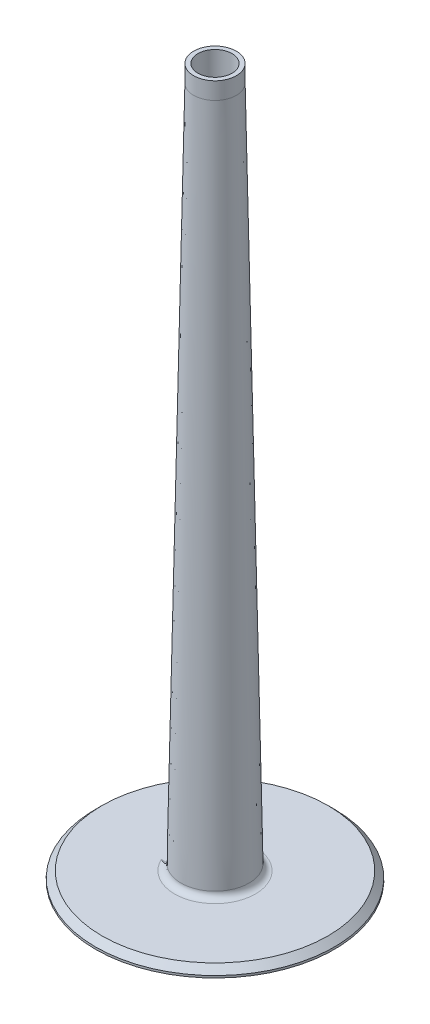
ISO-10303-21;
HEADER;
FILE_DESCRIPTION(('STEP AP214'),'2;1');
FILE_NAME('part.step','',(''),(''),'','','');
FILE_SCHEMA(('AUTOMOTIVE_DESIGN { 1 0 10303 214 1 1 1 1 }'));
ENDSEC;
DATA;
#1=APPLICATION_CONTEXT('core data for automotive mechanical design processes');
#2=APPLICATION_PROTOCOL_DEFINITION('international standard','automotive_design',2000,#1);
#3=PRODUCT_CONTEXT('',#1,'mechanical');
#4=PRODUCT('Part','Part','',(#3));
#5=PRODUCT_RELATED_PRODUCT_CATEGORY('part','',(#4));
#6=PRODUCT_DEFINITION_FORMATION('','',#4);
#7=PRODUCT_DEFINITION_CONTEXT('part definition',#1,'design');
#8=PRODUCT_DEFINITION('design','',#6,#7);
#9=PRODUCT_DEFINITION_SHAPE('','',#8);
#10=(LENGTH_UNIT() NAMED_UNIT(*) SI_UNIT(.MILLI.,.METRE.));
#11=(NAMED_UNIT(*) PLANE_ANGLE_UNIT() SI_UNIT($,.RADIAN.));
#12=(NAMED_UNIT(*) SI_UNIT($,.STERADIAN.) SOLID_ANGLE_UNIT());
#13=UNCERTAINTY_MEASURE_WITH_UNIT(LENGTH_MEASURE(1.E-05),#10,'distance_accuracy_value','');
#14=(GEOMETRIC_REPRESENTATION_CONTEXT(3) GLOBAL_UNCERTAINTY_ASSIGNED_CONTEXT((#13)) GLOBAL_UNIT_ASSIGNED_CONTEXT((#10,
#11,#12)) REPRESENTATION_CONTEXT('',''));
#15=CARTESIAN_POINT('',(0.,0.,0.));
#16=DIRECTION('',(0.,0.,1.));
#17=DIRECTION('',(1.,0.,0.));
#18=AXIS2_PLACEMENT_3D('',#15,#16,#17);
#19=CARTESIAN_POINT('',(0.,254.,0.));
#20=DIRECTION('',(0.,-1.,0.));
#21=DIRECTION('',(0.,0.,-1.));
#22=AXIS2_PLACEMENT_3D('',#19,#20,#21);
#23=CONICAL_SURFACE('',#22,7.9375,0.0187478031977445);
#24=CARTESIAN_POINT('',(-10.9986380954076,1.31233542988829E-08,6.3498));
#25=CARTESIAN_POINT('',(-10.9661542839363,1.8233393195671E-06,6.40607206991448));
#26=CARTESIAN_POINT('',(-10.9332096805369,0.00310269069035877,6.46201479725815));
#27=CARTESIAN_POINT('',(-10.8666748452448,0.0153468969863142,6.57284084258527));
#28=CARTESIAN_POINT('',(-10.8330846672008,0.0244897340620682,6.62772424817039));
#29=CARTESIAN_POINT('',(-10.7315971060793,0.0608037732642193,6.79044586185834));
#30=CARTESIAN_POINT('',(-10.6631335523318,0.0968591372913604,6.89609482020866));
#31=CARTESIAN_POINT('',(-10.5349289767664,0.18643584984036,7.08719809153657));
#32=CARTESIAN_POINT('',(-10.4750266462951,0.237726882466519,7.17360815162488));
#33=CARTESIAN_POINT('',(-10.3590417410145,0.357744114164864,7.33620002025002));
#34=CARTESIAN_POINT('',(-10.3029517020728,0.426434921148173,7.41240211697634));
#35=CARTESIAN_POINT('',(-10.2108354934768,0.56165114992968,7.53430871109204));
#36=CARTESIAN_POINT('',(-10.1732715971275,0.624537115578603,7.58290078618485));
#37=CARTESIAN_POINT('',(-10.1040072047982,0.759408570463965,7.67076859195739));
#38=CARTESIAN_POINT('',(-10.0722990805292,0.831382012606909,7.71005646230527));
#39=CARTESIAN_POINT('',(-10.0214488766076,0.970778224625026,7.77173685513282));
#40=CARTESIAN_POINT('',(-10.0010970258484,1.03699576980835,7.79584680184522));
#41=CARTESIAN_POINT('',(-9.9672621720457,1.17376969697781,7.83491118012799));
#42=CARTESIAN_POINT('',(-9.95377504044796,1.24432344241636,7.84987111575895));
#43=CARTESIAN_POINT('',(-9.93467318175553,1.38826201691278,7.86968760096606));
#44=CARTESIAN_POINT('',(-9.92909643153456,1.46165877691785,7.87449546508906));
#45=CARTESIAN_POINT('',(-9.92643180501236,1.60852621724321,7.87342379686221));
#46=CARTESIAN_POINT('',(-9.92934232422056,1.68199688096726,7.86754628462698));
#47=CARTESIAN_POINT('',(-9.94278697207492,1.82073908235096,7.84634684897258));
#48=CARTESIAN_POINT('',(-9.95269367573652,1.88619681619626,7.83181669384942));
#49=CARTESIAN_POINT('',(-9.97870464754827,2.01350027268655,7.79477109231769));
#50=CARTESIAN_POINT('',(-9.99481027634715,2.07534519889417,7.77225389285781));
#51=CARTESIAN_POINT('',(-10.0334166723422,2.19802223213817,7.71858747265611));
#52=CARTESIAN_POINT('',(-10.0562550585433,2.258547785773,7.68698559928534));
#53=CARTESIAN_POINT('',(-10.1065985965942,2.37345558209999,7.61709530115483));
#54=CARTESIAN_POINT('',(-10.1341058125403,2.42783508982519,7.5788039187332));
#55=CARTESIAN_POINT('',(-10.1978518813264,2.53909379207719,7.48934946494921));
#56=CARTESIAN_POINT('',(-10.234774460332,2.59471177563511,7.4371077353616));
#57=CARTESIAN_POINT('',(-10.3119965815803,2.69658731919294,7.32636341385606));
#58=CARTESIAN_POINT('',(-10.3522989149144,2.7428370328143,7.26785563599769));
#59=CARTESIAN_POINT('',(-10.4432901858431,2.83409361587009,7.13362319280051));
#60=CARTESIAN_POINT('',(-10.4944470406609,2.87701120879726,7.05679256274164));
#61=CARTESIAN_POINT('',(-10.5980846313508,2.94885649438555,6.89770137179443));
#62=CARTESIAN_POINT('',(-10.6505653896735,2.97778394963592,6.81544071878627));
#63=CARTESIAN_POINT('',(-10.7416690144113,3.01556466826313,6.66925237103833));
#64=CARTESIAN_POINT('',(-10.7803196545716,3.02769185550869,6.60616905803933));
#65=CARTESIAN_POINT('',(-10.8570140767606,3.04390338510256,6.47876710666235));
#66=CARTESIAN_POINT('',(-10.8950587864383,3.04800149483496,6.41445077414674));
#67=CARTESIAN_POINT('',(-10.9325978654994,3.04799998687663,6.3498));
#68=B_SPLINE_CURVE_WITH_KNOTS('',3,(#24,#25,#26,#27,#28,#29,#30,#31,#32,#33,#34,#35,#36,#37,#38,
#39,#40,#41,#42,#43,#44,#45,#46,#47,#48,#49,#50,#51,#52,#53,#54,#55,#56,#57,#58,#59,#60,#61,#62,
#63,#64,#65,#66,#67),.UNSPECIFIED.,.F.,.F.,(4,2,2,2,2,2,2,2,2,2,2,2,2,2,2,2,2,2,2,2,2,4),(0.,
0.19474624218606,0.389476310035777,0.779825918996431,1.12920632620116,1.47788170257181,
1.7406150269171,2.00300363747913,2.22214450305096,2.44115341753552,2.66121025173346,
2.8812254876024,3.08366918195934,3.28615733757051,3.50133963675868,3.71661731733759,
3.96999914654659,4.22359232568203,4.52778479726055,4.83198243076321,5.05646903045754,
5.28057036702371),.UNSPECIFIED.);
#69=CARTESIAN_POINT('',(-10.0900593872929,2.33538284217058,7.64005189175908));
#70=VERTEX_POINT('',#69);
#71=CARTESIAN_POINT('',(-10.9324817000762,3.048,6.35));
#72=VERTEX_POINT('',#71);
#73=EDGE_CURVE('E168',#70,#72,#68,.T.);
#74=ORIENTED_EDGE('',*,*,#73,.F.);
#75=CARTESIAN_POINT('',(0.,2.3353828421705,0.));
#76=DIRECTION('',(0.,1.,0.));
#77=DIRECTION('',(0.,0.,1.));
#78=AXIS2_PLACEMENT_3D('',#75,#76,#77);
#79=CIRCLE('',#78,12.6562115717093);
#80=CARTESIAN_POINT('',(-10.0900593872929,2.33538284217058,-7.64005189175908));
#81=VERTEX_POINT('',#80);
#82=EDGE_CURVE('E130',#70,#81,#79,.T.);
#83=ORIENTED_EDGE('',*,*,#82,.T.);
#84=CARTESIAN_POINT('',(-10.9325978654994,3.04799998687663,-6.3498));
#85=CARTESIAN_POINT('',(-10.8999979201371,3.04799780508361,-6.40593417678844));
#86=CARTESIAN_POINT('',(-10.8670360327973,3.0449123042439,-6.46179741861725));
#87=CARTESIAN_POINT('',(-10.8006542589209,3.03268977439008,-6.57259045315219));
#88=CARTESIAN_POINT('',(-10.7672343292529,3.02355217159326,-6.62752015684571));
#89=CARTESIAN_POINT('',(-10.6664357739375,2.98714087516176,-6.79072654074615));
#90=CARTESIAN_POINT('',(-10.5987755139002,2.9508703229383,-6.89697871548276));
#91=CARTESIAN_POINT('',(-10.4730979308032,2.86050085720492,-7.08918749483312));
#92=CARTESIAN_POINT('',(-10.4148273382496,2.80874517999183,-7.17609723820158));
#93=CARTESIAN_POINT('',(-10.302974296996,2.68735527570252,-7.33969690959744));
#94=CARTESIAN_POINT('',(-10.2493793656318,2.61777073472156,-7.41641435387412));
#95=CARTESIAN_POINT('',(-10.163955896329,2.48275537043931,-7.53708559341101));
#96=CARTESIAN_POINT('',(-10.1301872620934,2.42141146199877,-7.58425674264817));
#97=CARTESIAN_POINT('',(-10.0687004304121,2.29011021657658,-7.66975963828376));
#98=CARTESIAN_POINT('',(-10.0409748370741,2.22016357417996,-7.70810219300916));
#99=CARTESIAN_POINT('',(-9.99707248344839,2.08387342075445,-7.76909426221353));
#100=CARTESIAN_POINT('',(-9.97978845911007,2.01855662772188,-7.79323342323721));
#101=CARTESIAN_POINT('',(-9.9521679066627,1.88386625109741,-7.83255972654309));
#102=CARTESIAN_POINT('',(-9.94182740994984,1.8144950095339,-7.84775198185698));
#103=CARTESIAN_POINT('',(-9.92891257130494,1.67332364409966,-7.86834874614469));
#104=CARTESIAN_POINT('',(-9.92636660053408,1.60151560674109,-7.87371747016924));
#105=CARTESIAN_POINT('',(-9.92936949412806,1.45803311143739,-7.8742606509996));
#106=CARTESIAN_POINT('',(-9.93491826728178,1.38635865199622,-7.86943522267224));
#107=CARTESIAN_POINT('',(-9.95308210272741,1.24959843405244,-7.85058820690649));
#108=CARTESIAN_POINT('',(-9.96525892412575,1.18437393339872,-7.83712853802717));
#109=CARTESIAN_POINT('',(-9.99553457201065,1.05751939922595,-7.80234353069956));
#110=CARTESIAN_POINT('',(-10.0136349211939,0.995890294740902,-7.78101616960982));
#111=CARTESIAN_POINT('',(-10.056511386377,0.87217877915044,-7.72933923751777));
#112=CARTESIAN_POINT('',(-10.0817259859012,0.810508200796656,-7.69837414057168));
#113=CARTESIAN_POINT('',(-10.1366611808046,0.693363388835278,-7.62954736864455));
#114=CARTESIAN_POINT('',(-10.1663839489561,0.637892165602109,-7.59168236637951));
#115=CARTESIAN_POINT('',(-10.2351130907099,0.523695473751836,-7.5024579274402));
#116=CARTESIAN_POINT('',(-10.2748135193867,0.466325644177062,-7.44990013269533));
#117=CARTESIAN_POINT('',(-10.3573805605564,0.361177351411474,-7.33808862851842));
#118=CARTESIAN_POINT('',(-10.4002499596277,0.313407470359724,-7.27882900109429));
#119=CARTESIAN_POINT('',(-10.4965870141623,0.219142261434897,-7.14251880446839));
#120=CARTESIAN_POINT('',(-10.5504668950896,0.174789655795451,-7.06427382255195));
#121=CARTESIAN_POINT('',(-10.6591216929124,0.100598865606217,-6.90179473748161));
#122=CARTESIAN_POINT('',(-10.713896448689,0.0707580973815089,-6.81756170349842));
#123=CARTESIAN_POINT('',(-10.8074032347668,0.0324591710569328,-6.66932767287035));
#124=CARTESIAN_POINT('',(-10.8462883338145,0.0203396013859075,-6.60634745574944));
#125=CARTESIAN_POINT('',(-10.9232053159484,0.00411528454027798,-6.47898223081162));
#126=CARTESIAN_POINT('',(-10.961238354343,-1.05757921220453E-06,-6.41459939214499));
#127=CARTESIAN_POINT('',(-10.9986380954076,1.31233542561888E-08,-6.3498));
#128=B_SPLINE_CURVE_WITH_KNOTS('',3,(#84,#85,#86,#87,#88,#89,#90,#91,#92,#93,#94,#95,#96,#97,
#98,#99,#100,#101,#102,#103,#104,#105,#106,#107,#108,#109,#110,#111,#112,#113,#114,#115,#116,
#117,#118,#119,#120,#121,#122,#123,#124,#125,#126,#127),.UNSPECIFIED.,.F.,.F.,(4,2,2,2,2,2,2,2,
2,2,2,2,2,2,2,2,2,2,2,2,2,4),(0.,0.194566838668165,0.389152126310308,0.779832459861628,
1.12839981955684,1.47600614956844,1.72835909242503,1.98040143210367,2.1947334460207,
2.40894285302142,2.62393103571093,2.83891679594486,3.04116231330677,3.24345986061007,
3.4630551781796,3.68275667095821,3.94384758700948,4.20517088422039,4.51846338558939,
4.83170008819453,5.05628730426847,5.28054889889109),.UNSPECIFIED.);
#129=CARTESIAN_POINT('',(-10.9324817000762,3.04799999999999,-6.35));
#130=VERTEX_POINT('',#129);
#131=EDGE_CURVE('E149',#130,#81,#128,.T.);
#132=ORIENTED_EDGE('',*,*,#131,.F.);
#133=CARTESIAN_POINT('',(0.,3.048,0.));
#134=DIRECTION('',(0.,1.,0.));
#135=DIRECTION('',(0.,0.,1.));
#136=AXIS2_PLACEMENT_3D('',#133,#134,#135);
#137=CIRCLE('',#136,12.64285);
#138=EDGE_CURVE('E157',#72,#130,#137,.F.);
#139=ORIENTED_EDGE('',*,*,#138,.F.);
#140=EDGE_LOOP('',(#74,#83,#132,#139));
#141=FACE_BOUND('',#140,.T.);
#142=CARTESIAN_POINT('',(0.,254.,0.));
#143=DIRECTION('',(0.,1.,0.));
#144=DIRECTION('',(0.,0.,1.));
#145=AXIS2_PLACEMENT_3D('',#142,#143,#144);
#146=CIRCLE('',#145,7.9375);
#147=CARTESIAN_POINT('',(0.,254.,7.9375));
#148=VERTEX_POINT('',#147);
#149=EDGE_CURVE('E113',#148,#148,#146,.T.);
#150=ORIENTED_EDGE('',*,*,#149,.F.);
#151=EDGE_LOOP('',(#150));
#152=FACE_BOUND('',#151,.T.);
#153=ADVANCED_FACE('F33',(#141,#152),#23,.T.);
#154=CARTESIAN_POINT('',(0.,-3.175,0.));
#155=DIRECTION('',(0.,-1.,0.));
#156=DIRECTION('',(0.,0.,-1.));
#157=AXIS2_PLACEMENT_3D('',#154,#155,#156);
#158=PLANE('',#157);
#159=CARTESIAN_POINT('',(0.,-3.175,0.));
#160=DIRECTION('',(0.,-1.,0.));
#161=DIRECTION('',(0.,0.,-1.));
#162=AXIS2_PLACEMENT_3D('',#159,#160,#161);
#163=CIRCLE('',#162,44.45);
#164=CARTESIAN_POINT('',(0.,-3.175,-44.45));
#165=VERTEX_POINT('',#164);
#166=EDGE_CURVE('E114',#165,#165,#163,.T.);
#167=ORIENTED_EDGE('',*,*,#166,.T.);
#168=EDGE_LOOP('',(#167));
#169=FACE_BOUND('',#168,.T.);
#170=ADVANCED_FACE('F163',(#169),#158,.T.);
#171=CARTESIAN_POINT('',(0.,-3.175,0.));
#172=DIRECTION('',(0.,1.,0.));
#173=DIRECTION('',(0.,0.,1.));
#174=AXIS2_PLACEMENT_3D('',#171,#172,#173);
#175=CYLINDRICAL_SURFACE('',#174,44.45);
#176=CARTESIAN_POINT('',(0.,-2.38000000000001,0.));
#177=DIRECTION('',(0.,-1.,0.));
#178=DIRECTION('',(0.,0.,-1.));
#179=AXIS2_PLACEMENT_3D('',#176,#177,#178);
#180=CIRCLE('',#179,44.45);
#181=CARTESIAN_POINT('',(0.,-2.38000000000002,-44.45));
#182=VERTEX_POINT('',#181);
#183=EDGE_CURVE('E117',#182,#182,#180,.T.);
#184=ORIENTED_EDGE('',*,*,#183,.T.);
#185=EDGE_LOOP('',(#184));
#186=FACE_BOUND('',#185,.T.);
#187=ORIENTED_EDGE('',*,*,#166,.F.);
#188=EDGE_LOOP('',(#187));
#189=FACE_BOUND('',#188,.T.);
#190=ADVANCED_FACE('F195',(#186,#189),#175,.T.);
#191=CARTESIAN_POINT('',(0.,-2.38000000000001,0.));
#192=DIRECTION('',(0.,-1.,0.));
#193=DIRECTION('',(0.,0.,-1.));
#194=AXIS2_PLACEMENT_3D('',#191,#192,#193);
#195=CONICAL_SURFACE('',#194,44.45,0.785398163397451);
#196=CARTESIAN_POINT('',(0.,0.,0.));
#197=DIRECTION('',(0.,-1.,0.));
#198=DIRECTION('',(0.,0.,-1.));
#199=AXIS2_PLACEMENT_3D('',#196,#197,#198);
#200=CIRCLE('',#199,42.07);
#201=CARTESIAN_POINT('',(0.,0.,-42.07));
#202=VERTEX_POINT('',#201);
#203=EDGE_CURVE('E101',#202,#202,#200,.F.);
#204=ORIENTED_EDGE('',*,*,#203,.F.);
#205=EDGE_LOOP('',(#204));
#206=FACE_BOUND('',#205,.T.);
#207=ORIENTED_EDGE('',*,*,#183,.F.);
#208=EDGE_LOOP('',(#207));
#209=FACE_BOUND('',#208,.T.);
#210=ADVANCED_FACE('F166',(#206,#209),#195,.T.);
#211=CARTESIAN_POINT('',(0.,260.35,0.));
#212=DIRECTION('',(0.,1.,0.));
#213=DIRECTION('',(0.,0.,1.));
#214=AXIS2_PLACEMENT_3D('',#211,#212,#213);
#215=PLANE('',#214);
#216=CARTESIAN_POINT('',(0.,260.35,0.));
#217=DIRECTION('',(0.,1.,0.));
#218=DIRECTION('',(0.,0.,1.));
#219=AXIS2_PLACEMENT_3D('',#216,#217,#218);
#220=CIRCLE('',#219,7.93750000000001);
#221=CARTESIAN_POINT('',(0.,260.35,7.93750000000001));
#222=VERTEX_POINT('',#221);
#223=EDGE_CURVE('E120',#222,#222,#220,.T.);
#224=ORIENTED_EDGE('',*,*,#223,.T.);
#225=EDGE_LOOP('',(#224));
#226=FACE_BOUND('',#225,.T.);
#227=CARTESIAN_POINT('',(0.,260.35,0.));
#228=DIRECTION('',(0.,1.,0.));
#229=DIRECTION('',(0.,0.,1.));
#230=AXIS2_PLACEMENT_3D('',#227,#228,#229);
#231=CIRCLE('',#230,6.35);
#232=CARTESIAN_POINT('',(0.,260.35,6.35));
#233=VERTEX_POINT('',#232);
#234=EDGE_CURVE('E174',#233,#233,#231,.T.);
#235=ORIENTED_EDGE('',*,*,#234,.F.);
#236=EDGE_LOOP('',(#235));
#237=FACE_BOUND('',#236,.T.);
#238=ADVANCED_FACE('F179',(#226,#237),#215,.T.);
#239=CARTESIAN_POINT('',(0.,260.35,0.));
#240=DIRECTION('',(0.,-1.,0.));
#241=DIRECTION('',(0.,0.,-1.));
#242=AXIS2_PLACEMENT_3D('',#239,#240,#241);
#243=CYLINDRICAL_SURFACE('',#242,7.93750000000001);
#244=ORIENTED_EDGE('',*,*,#223,.F.);
#245=EDGE_LOOP('',(#244));
#246=FACE_BOUND('',#245,.T.);
#247=ORIENTED_EDGE('',*,*,#149,.T.);
#248=EDGE_LOOP('',(#247));
#249=FACE_BOUND('',#248,.T.);
#250=ADVANCED_FACE('F182',(#246,#249),#243,.T.);
#251=CARTESIAN_POINT('',(0.,0.,0.));
#252=DIRECTION('',(0.,-1.,0.));
#253=DIRECTION('',(0.,0.,-1.));
#254=AXIS2_PLACEMENT_3D('',#251,#252,#253);
#255=PLANE('',#254);
#256=DIRECTION('',(1.,0.,0.));
#257=VECTOR('',#256,1.);
#258=CARTESIAN_POINT('',(-16.51,0.,-6.35));
#259=LINE('',#258,#257);
#260=CARTESIAN_POINT('',(-13.6291078519576,0.,-6.35));
#261=VERTEX_POINT('',#260);
#262=CARTESIAN_POINT('',(0.,0.,-6.35));
#263=VERTEX_POINT('',#262);
#264=EDGE_CURVE('E54',#261,#263,#259,.T.);
#265=ORIENTED_EDGE('',*,*,#264,.F.);
#266=CARTESIAN_POINT('',(0.,0.,0.));
#267=DIRECTION('',(0.,-1.,0.));
#268=DIRECTION('',(0.,0.,-1.));
#269=AXIS2_PLACEMENT_3D('',#266,#267,#268);
#270=CIRCLE('',#269,15.0357933226116);
#271=CARTESIAN_POINT('',(-13.6291078519576,0.,6.35));
#272=VERTEX_POINT('',#271);
#273=EDGE_CURVE('E88',#261,#272,#270,.T.);
#274=ORIENTED_EDGE('',*,*,#273,.T.);
#275=DIRECTION('',(1.,0.,0.));
#276=VECTOR('',#275,1.);
#277=CARTESIAN_POINT('',(-16.51,0.,6.35));
#278=LINE('',#277,#276);
#279=CARTESIAN_POINT('',(0.,0.,6.35));
#280=VERTEX_POINT('',#279);
#281=EDGE_CURVE('E61',#272,#280,#278,.T.);
#282=ORIENTED_EDGE('',*,*,#281,.T.);
#283=CARTESIAN_POINT('',(0.,0.,0.));
#284=DIRECTION('',(0.,1.,0.));
#285=DIRECTION('',(0.,0.,1.));
#286=AXIS2_PLACEMENT_3D('',#283,#284,#285);
#287=CIRCLE('',#286,6.35);
#288=EDGE_CURVE('E86',#280,#263,#287,.T.);
#289=ORIENTED_EDGE('',*,*,#288,.T.);
#290=EDGE_LOOP('',(#265,#274,#282,#289));
#291=FACE_BOUND('',#290,.T.);
#292=ORIENTED_EDGE('',*,*,#203,.T.);
#293=EDGE_LOOP('',(#292));
#294=FACE_BOUND('',#293,.T.);
#295=ADVANCED_FACE('F83',(#291,#294),#255,.F.);
#296=CARTESIAN_POINT('',(0.,0.,0.));
#297=DIRECTION('',(0.,1.,0.));
#298=DIRECTION('',(0.,0.,1.));
#299=AXIS2_PLACEMENT_3D('',#296,#297,#298);
#300=CYLINDRICAL_SURFACE('',#299,6.35);
#301=CARTESIAN_POINT('',(0.,3.04799999999999,0.));
#302=DIRECTION('',(0.,1.,0.));
#303=DIRECTION('',(0.,0.,1.));
#304=AXIS2_PLACEMENT_3D('',#301,#302,#303);
#305=CIRCLE('',#304,6.35);
#306=CARTESIAN_POINT('',(0.,3.04799999999999,6.35000000000001));
#307=VERTEX_POINT('',#306);
#308=CARTESIAN_POINT('',(0.,3.04799999999999,-6.35));
#309=VERTEX_POINT('',#308);
#310=EDGE_CURVE('E100',#307,#309,#305,.F.);
#311=ORIENTED_EDGE('',*,*,#310,.T.);
#312=DIRECTION('',(0.,1.,0.));
#313=VECTOR('',#312,1.);
#314=CARTESIAN_POINT('',(0.,0.,-6.34999999999999));
#315=LINE('',#314,#313);
#316=EDGE_CURVE('E112',#309,#263,#315,.F.);
#317=ORIENTED_EDGE('',*,*,#316,.T.);
#318=ORIENTED_EDGE('',*,*,#288,.F.);
#319=DIRECTION('',(0.,1.,0.));
#320=VECTOR('',#319,1.);
#321=CARTESIAN_POINT('',(0.,0.,6.35000000000001));
#322=LINE('',#321,#320);
#323=EDGE_CURVE('E94',#280,#307,#322,.T.);
#324=ORIENTED_EDGE('',*,*,#323,.T.);
#325=EDGE_LOOP('',(#311,#317,#318,#324));
#326=FACE_BOUND('',#325,.T.);
#327=ORIENTED_EDGE('',*,*,#234,.T.);
#328=EDGE_LOOP('',(#327));
#329=FACE_BOUND('',#328,.T.);
#330=ADVANCED_FACE('F109',(#326,#329),#300,.F.);
#331=CARTESIAN_POINT('',(-16.51,3.04799999999999,6.35));
#332=DIRECTION('',(0.,1.,0.));
#333=DIRECTION('',(0.,0.,1.));
#334=AXIS2_PLACEMENT_3D('',#331,#332,#333);
#335=PLANE('',#334);
#336=ORIENTED_EDGE('',*,*,#138,.T.);
#337=DIRECTION('',(1.,0.,0.));
#338=VECTOR('',#337,1.);
#339=CARTESIAN_POINT('',(-16.51,3.04799999999999,-6.35));
#340=LINE('',#339,#338);
#341=EDGE_CURVE('E293',#130,#309,#340,.T.);
#342=ORIENTED_EDGE('',*,*,#341,.T.);
#343=ORIENTED_EDGE('',*,*,#310,.F.);
#344=DIRECTION('',(1.,0.,0.));
#345=VECTOR('',#344,1.);
#346=CARTESIAN_POINT('',(-16.51,3.04799999999999,6.35));
#347=LINE('',#346,#345);
#348=EDGE_CURVE('E105',#72,#307,#347,.T.);
#349=ORIENTED_EDGE('',*,*,#348,.F.);
#350=EDGE_LOOP('',(#336,#342,#343,#349));
#351=FACE_BOUND('',#350,.T.);
#352=ADVANCED_FACE('F143',(#351),#335,.F.);
#353=CARTESIAN_POINT('',(0.,1.52399999999999,6.35));
#354=DIRECTION('',(1.,0.,0.));
#355=DIRECTION('',(0.,0.,-1.));
#356=AXIS2_PLACEMENT_3D('',#353,#354,#355);
#357=PLANE('',#356);
#358=CARTESIAN_POINT('',(0.,1.52399999999999,-6.35));
#359=DIRECTION('',(1.,0.,0.));
#360=DIRECTION('',(0.,0.,-1.));
#361=AXIS2_PLACEMENT_3D('',#358,#359,#360);
#362=CIRCLE('',#361,1.524);
#363=EDGE_CURVE('E90',#263,#309,#362,.T.);
#364=ORIENTED_EDGE('',*,*,#363,.F.);
#365=ORIENTED_EDGE('',*,*,#316,.F.);
#366=EDGE_LOOP('',(#364,#365));
#367=FACE_BOUND('',#366,.T.);
#368=ADVANCED_FACE('F236',(#367),#357,.F.);
#369=CARTESIAN_POINT('',(0.,1.52399999999999,6.35));
#370=DIRECTION('',(1.,0.,0.));
#371=DIRECTION('',(0.,0.,-1.));
#372=AXIS2_PLACEMENT_3D('',#369,#370,#371);
#373=CIRCLE('',#372,1.524);
#374=EDGE_CURVE('E96',#307,#280,#373,.T.);
#375=ORIENTED_EDGE('',*,*,#374,.F.);
#376=ORIENTED_EDGE('',*,*,#323,.F.);
#377=EDGE_LOOP('',(#375,#376));
#378=FACE_BOUND('',#377,.T.);
#379=ADVANCED_FACE('F95',(#378),#357,.F.);
#380=CARTESIAN_POINT('',(-16.51,1.52399999999999,6.35));
#381=DIRECTION('',(1.,0.,0.));
#382=DIRECTION('',(0.,0.,-1.));
#383=AXIS2_PLACEMENT_3D('',#380,#381,#382);
#384=CYLINDRICAL_SURFACE('',#383,1.524);
#385=ORIENTED_EDGE('',*,*,#281,.F.);
#386=CARTESIAN_POINT('',(-10.0900593872929,2.33538284217058,7.64005189175908));
#387=CARTESIAN_POINT('',(-10.0720602804357,2.29572742165215,7.66503896221443));
#388=CARTESIAN_POINT('',(-10.0562530889686,2.254000315731,7.68868304057025));
#389=CARTESIAN_POINT('',(-10.0303546389345,2.16684633055324,7.73263939915232));
#390=CARTESIAN_POINT('',(-10.0202984851309,2.12139862485054,7.75293069038195));
#391=CARTESIAN_POINT('',(-10.0074390312704,2.02739905708821,7.78934807411145));
#392=CARTESIAN_POINT('',(-10.0046895667632,1.97882684000557,7.80544246597517));
#393=CARTESIAN_POINT('',(-10.007517194515,1.88069509465623,7.8325391902321));
#394=CARTESIAN_POINT('',(-10.0130629911556,1.83113996971219,7.8435604571741));
#395=CARTESIAN_POINT('',(-10.0313127336407,1.73762446623146,7.85962633968218));
#396=CARTESIAN_POINT('',(-10.0432576806389,1.69359385920215,7.86515277710417));
#397=CARTESIAN_POINT('',(-10.0729639897776,1.6071700954112,7.87234856439746));
#398=CARTESIAN_POINT('',(-10.0907359423986,1.564780078414,7.8740108463966));
#399=CARTESIAN_POINT('',(-10.1403908345534,1.46324736900526,7.8739839735773));
#400=CARTESIAN_POINT('',(-10.1749961281119,1.40544750627178,7.87038410941652));
#401=CARTESIAN_POINT('',(-10.2513081503038,1.29542253634189,7.85778445733436));
#402=CARTESIAN_POINT('',(-10.2930312980392,1.24321078317415,7.84877206010692));
#403=CARTESIAN_POINT('',(-10.3753906835681,1.15067382926394,7.82822044612942));
#404=CARTESIAN_POINT('',(-10.4154287382914,1.10969224041141,7.81717902648637));
#405=CARTESIAN_POINT('',(-10.4981728306374,1.03125661034391,7.792728568454));
#406=CARTESIAN_POINT('',(-10.5408809192753,0.993805337758593,7.77931769513836));
#407=CARTESIAN_POINT('',(-10.6720793968919,0.886036784962199,7.73621829448046));
#408=CARTESIAN_POINT('',(-10.7635150150513,0.82044148881619,7.70369732214776));
#409=CARTESIAN_POINT('',(-10.9517619157138,0.698768309005792,7.6331766984595));
#410=CARTESIAN_POINT('',(-11.0486188802185,0.642795454358483,7.5951240488696));
#411=CARTESIAN_POINT('',(-11.2452891410575,0.539362616524295,7.51504978054109));
#412=CARTESIAN_POINT('',(-11.3451052325073,0.491911001447637,7.47302432152286));
#413=CARTESIAN_POINT('',(-11.5467446810817,0.404383584107873,7.38578734410734));
#414=CARTESIAN_POINT('',(-11.6485710050895,0.364319752752304,7.34057081609132));
#415=CARTESIAN_POINT('',(-11.8534633555565,0.290915294424784,7.24754461521997));
#416=CARTESIAN_POINT('',(-11.9565296396434,0.257576091121044,7.19973439596833));
#417=CARTESIAN_POINT('',(-12.1891454201394,0.189661358691503,7.08977592089116));
#418=CARTESIAN_POINT('',(-12.3189163886739,0.156834292727333,7.02701515933704));
#419=CARTESIAN_POINT('',(-12.5791102049355,0.100460163744359,6.89865468538222));
#420=CARTESIAN_POINT('',(-12.7095332647812,0.0769163503905098,6.83305398774518));
#421=CARTESIAN_POINT('',(-12.970185749837,0.0390506201098956,6.6997042875943));
#422=CARTESIAN_POINT('',(-13.1004148227325,0.0247053789568853,6.63196117932103));
#423=CARTESIAN_POINT('',(-13.3605549825459,0.00530017492145727,6.49466925377887));
#424=CARTESIAN_POINT('',(-13.4904662026489,0.000235230987990854,6.42512142550672));
#425=CARTESIAN_POINT('',(-13.6230332320899,2.67332205513943E-06,6.35329279100805));
#426=CARTESIAN_POINT('',(-13.6260706486791,5.07636985549978E-09,6.35164656825797));
#427=CARTESIAN_POINT('',(-13.6291078519576,0.,6.35));
#428=B_SPLINE_CURVE_WITH_KNOTS('',3,(#386,#387,#388,#389,#390,#391,#392,#393,#394,#395,#396,
#397,#398,#399,#400,#401,#402,#403,#404,#405,#406,#407,#408,#409,#410,#411,#412,#413,#414,#415,
#416,#417,#418,#419,#420,#421,#422,#423,#424,#425,#426,#427),.UNSPECIFIED.,.F.,.F.,(4,2,2,2,2,2,
2,2,2,2,2,2,2,2,2,2,2,2,2,2,4),(0.,0.150800775459035,0.302512486072246,0.455338945990164,
0.607590288325,0.74484276159701,0.882346084567962,1.08358800415086,1.28530057545945,
1.46009083609404,1.63501705396371,1.98543677847842,2.33946713716988,2.69384328526843,
3.04878870094931,3.4038091832852,3.84698089518663,4.29030760488665,4.73250570747291,
5.17446639769849,5.18483092889774),.UNSPECIFIED.);
#429=EDGE_CURVE('E11',#272,#70,#428,.F.);
#430=ORIENTED_EDGE('',*,*,#429,.T.);
#431=ORIENTED_EDGE('',*,*,#73,.T.);
#432=ORIENTED_EDGE('',*,*,#348,.T.);
#433=ORIENTED_EDGE('',*,*,#374,.T.);
#434=EDGE_LOOP('',(#385,#430,#431,#432,#433));
#435=FACE_BOUND('',#434,.T.);
#436=ADVANCED_FACE('F103',(#435),#384,.F.);
#437=CARTESIAN_POINT('',(-16.51,1.52399999999999,-6.35));
#438=DIRECTION('',(1.,0.,0.));
#439=DIRECTION('',(0.,0.,-1.));
#440=AXIS2_PLACEMENT_3D('',#437,#438,#439);
#441=CYLINDRICAL_SURFACE('',#440,1.524);
#442=ORIENTED_EDGE('',*,*,#131,.T.);
#443=CARTESIAN_POINT('',(-10.0900593872929,2.33538284217057,-7.64005189175907));
#444=CARTESIAN_POINT('',(-10.0720602804357,2.29572742165215,-7.66503896221443));
#445=CARTESIAN_POINT('',(-10.0562530889686,2.254000315731,-7.68868304057025));
#446=CARTESIAN_POINT('',(-10.0303546389345,2.16684633055324,-7.73263939915232));
#447=CARTESIAN_POINT('',(-10.0202984851309,2.12139862485054,-7.75293069038195));
#448=CARTESIAN_POINT('',(-10.0074390312704,2.02739905708822,-7.78934807411145));
#449=CARTESIAN_POINT('',(-10.0046895667632,1.97882684000557,-7.80544246597517));
#450=CARTESIAN_POINT('',(-10.007517194515,1.88069509465623,-7.8325391902321));
#451=CARTESIAN_POINT('',(-10.0130629911556,1.83113996971219,-7.8435604571741));
#452=CARTESIAN_POINT('',(-10.0313127336407,1.73762446623146,-7.85962633968218));
#453=CARTESIAN_POINT('',(-10.0432576806389,1.69359385920215,-7.86515277710417));
#454=CARTESIAN_POINT('',(-10.0729639897776,1.6071700954112,-7.87234856439746));
#455=CARTESIAN_POINT('',(-10.0907359423986,1.564780078414,-7.8740108463966));
#456=CARTESIAN_POINT('',(-10.1403908345534,1.46324736900526,-7.8739839735773));
#457=CARTESIAN_POINT('',(-10.1749961281119,1.40544750627178,-7.87038410941652));
#458=CARTESIAN_POINT('',(-10.2513081503038,1.29542253634189,-7.85778445733436));
#459=CARTESIAN_POINT('',(-10.2930312980392,1.24321078317415,-7.84877206010692));
#460=CARTESIAN_POINT('',(-10.3753906835681,1.15067382926394,-7.82822044612942));
#461=CARTESIAN_POINT('',(-10.4154287382914,1.10969224041141,-7.81717902648637));
#462=CARTESIAN_POINT('',(-10.4981728306374,1.03125661034391,-7.792728568454));
#463=CARTESIAN_POINT('',(-10.5408809192753,0.993805337758593,-7.77931769513836));
#464=CARTESIAN_POINT('',(-10.6720793968919,0.886036784962198,-7.73621829448046));
#465=CARTESIAN_POINT('',(-10.7635150150513,0.820441488816188,-7.70369732214776));
#466=CARTESIAN_POINT('',(-10.9517619157138,0.698768309005789,-7.6331766984595));
#467=CARTESIAN_POINT('',(-11.0486188802185,0.642795454358479,-7.59512404886959));
#468=CARTESIAN_POINT('',(-11.2452891410575,0.53936261652429,-7.51504978054109));
#469=CARTESIAN_POINT('',(-11.3451052325074,0.491911001447632,-7.47302432152285));
#470=CARTESIAN_POINT('',(-11.5467446810817,0.404383584107867,-7.38578734410734));
#471=CARTESIAN_POINT('',(-11.6485710050895,0.364319752752299,-7.34057081609132));
#472=CARTESIAN_POINT('',(-11.8534633555565,0.290915294424781,-7.24754461521997));
#473=CARTESIAN_POINT('',(-11.9565296396434,0.257576091121042,-7.19973439596833));
#474=CARTESIAN_POINT('',(-12.1891454201394,0.189661358691501,-7.08977592089115));
#475=CARTESIAN_POINT('',(-12.318916388674,0.156834292727332,-7.02701515933705));
#476=CARTESIAN_POINT('',(-12.5791102049355,0.100460163744359,-6.89865468538222));
#477=CARTESIAN_POINT('',(-12.7095332647811,0.0769163503905103,-6.83305398774516));
#478=CARTESIAN_POINT('',(-12.970185749837,0.0390506201098961,-6.69970428759432));
#479=CARTESIAN_POINT('',(-13.1004148227325,0.0247053789568854,-6.6319611793211));
#480=CARTESIAN_POINT('',(-13.3605549825459,0.00530017492145767,-6.4946692537788));
#481=CARTESIAN_POINT('',(-13.4904662026488,0.000235230987992164,-6.42512142550646));
#482=CARTESIAN_POINT('',(-13.6230332320898,2.67332205511193E-06,-6.35329279100804));
#483=CARTESIAN_POINT('',(-13.6260706486791,5.07636979608465E-09,-6.35164656825796));
#484=CARTESIAN_POINT('',(-13.6291078519576,0.,-6.35));
#485=B_SPLINE_CURVE_WITH_KNOTS('',3,(#443,#444,#445,#446,#447,#448,#449,#450,#451,#452,#453,
#454,#455,#456,#457,#458,#459,#460,#461,#462,#463,#464,#465,#466,#467,#468,#469,#470,#471,#472,
#473,#474,#475,#476,#477,#478,#479,#480,#481,#482,#483,#484),.UNSPECIFIED.,.F.,.F.,(4,2,2,2,2,2,
2,2,2,2,2,2,2,2,2,2,2,2,2,2,4),(0.,0.150800775459036,0.302512486072246,0.455338945990165,
0.607590288325002,0.744842761597012,0.882346084567964,1.08358800415086,1.28530057545946,
1.46009083609405,1.63501705396371,1.98543677847842,2.33946713716989,2.69384328526845,
3.04878870094933,3.40380918328522,3.84698089518664,4.29030760488664,4.7325057074729,
5.17446639769849,5.18483092889774),.UNSPECIFIED.);
#486=EDGE_CURVE('E47',#81,#261,#485,.T.);
#487=ORIENTED_EDGE('',*,*,#486,.T.);
#488=ORIENTED_EDGE('',*,*,#264,.T.);
#489=ORIENTED_EDGE('',*,*,#363,.T.);
#490=ORIENTED_EDGE('',*,*,#341,.F.);
#491=EDGE_LOOP('',(#442,#487,#488,#489,#490));
#492=FACE_BOUND('',#491,.T.);
#493=ADVANCED_FACE('F138',(#492),#441,.F.);
#494=CARTESIAN_POINT('',(0.,2.37999999999999,0.));
#495=DIRECTION('',(0.,-1.,0.));
#496=DIRECTION('',(0.,0.,-1.));
#497=AXIS2_PLACEMENT_3D('',#494,#495,#496);
#498=TOROIDAL_SURFACE('',#497,15.0357933226116,2.38);
#499=ORIENTED_EDGE('',*,*,#429,.F.);
#500=ORIENTED_EDGE('',*,*,#273,.F.);
#501=ORIENTED_EDGE('',*,*,#486,.F.);
#502=ORIENTED_EDGE('',*,*,#82,.F.);
#503=EDGE_LOOP('',(#499,#500,#501,#502));
#504=FACE_BOUND('',#503,.T.);
#505=ADVANCED_FACE('F35',(#504),#498,.F.);
#506=CLOSED_SHELL('',(#153,#170,#190,#210,#238,#250,#295,#330,#352,#368,#379,#436,#493,#505));
#507=MANIFOLD_SOLID_BREP('B2',#506);
#508=ADVANCED_BREP_SHAPE_REPRESENTATION('',(#18,#507),#14);
#509=SHAPE_DEFINITION_REPRESENTATION(#9,#508);
ENDSEC;
END-ISO-10303-21;
